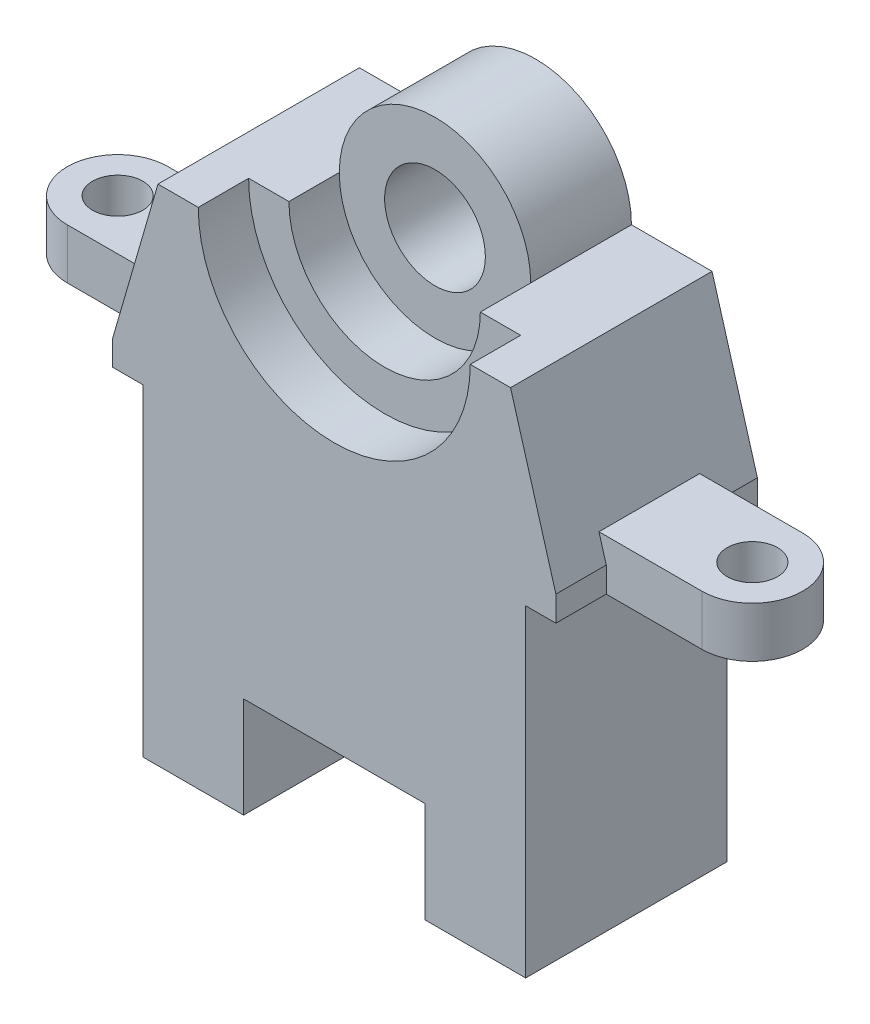
ISO-10303-21;
HEADER;
FILE_DESCRIPTION(('STEP AP214'),'2;1');
FILE_NAME('part.step','',(''),(''),'','','');
FILE_SCHEMA(('AUTOMOTIVE_DESIGN { 1 0 10303 214 1 1 1 1 }'));
ENDSEC;
DATA;
#1=APPLICATION_CONTEXT('core data for automotive mechanical design processes');
#2=APPLICATION_PROTOCOL_DEFINITION('international standard','automotive_design',2000,#1);
#3=PRODUCT_CONTEXT('',#1,'mechanical');
#4=PRODUCT('Part','Part','',(#3));
#5=PRODUCT_RELATED_PRODUCT_CATEGORY('part','',(#4));
#6=PRODUCT_DEFINITION_FORMATION('','',#4);
#7=PRODUCT_DEFINITION_CONTEXT('part definition',#1,'design');
#8=PRODUCT_DEFINITION('design','',#6,#7);
#9=PRODUCT_DEFINITION_SHAPE('','',#8);
#10=(LENGTH_UNIT() NAMED_UNIT(*) SI_UNIT(.MILLI.,.METRE.));
#11=(NAMED_UNIT(*) PLANE_ANGLE_UNIT() SI_UNIT($,.RADIAN.));
#12=(NAMED_UNIT(*) SI_UNIT($,.STERADIAN.) SOLID_ANGLE_UNIT());
#13=UNCERTAINTY_MEASURE_WITH_UNIT(LENGTH_MEASURE(1.E-05),#10,'distance_accuracy_value','');
#14=(GEOMETRIC_REPRESENTATION_CONTEXT(3) GLOBAL_UNCERTAINTY_ASSIGNED_CONTEXT((#13)) GLOBAL_UNIT_ASSIGNED_CONTEXT((#10,
#11,#12)) REPRESENTATION_CONTEXT('',''));
#15=CARTESIAN_POINT('',(0.,0.,0.));
#16=DIRECTION('',(0.,0.,1.));
#17=DIRECTION('',(1.,0.,0.));
#18=AXIS2_PLACEMENT_3D('',#15,#16,#17);
#19=CARTESIAN_POINT('',(82.,64.,40.));
#20=DIRECTION('',(-1.,0.,0.));
#21=DIRECTION('',(0.,0.,1.));
#22=AXIS2_PLACEMENT_3D('',#19,#20,#21);
#23=PLANE('',#22);
#24=DIRECTION('',(0.,-1.,0.));
#25=VECTOR('',#24,1.);
#26=CARTESIAN_POINT('',(82.,64.,30.));
#27=LINE('',#26,#25);
#28=CARTESIAN_POINT('',(82.,69.,30.));
#29=VERTEX_POINT('',#28);
#30=CARTESIAN_POINT('',(82.,64.,30.));
#31=VERTEX_POINT('',#30);
#32=EDGE_CURVE('E262',#29,#31,#27,.T.);
#33=ORIENTED_EDGE('',*,*,#32,.F.);
#34=DIRECTION('',(0.,0.,-1.));
#35=VECTOR('',#34,1.);
#36=CARTESIAN_POINT('',(82.,69.,40.));
#37=LINE('',#36,#35);
#38=CARTESIAN_POINT('',(82.,69.,40.));
#39=VERTEX_POINT('',#38);
#40=EDGE_CURVE('E423',#39,#29,#37,.T.);
#41=ORIENTED_EDGE('',*,*,#40,.F.);
#42=DIRECTION('',(0.,1.,0.));
#43=VECTOR('',#42,1.);
#44=CARTESIAN_POINT('',(82.,64.,40.));
#45=LINE('',#44,#43);
#46=CARTESIAN_POINT('',(82.,64.,40.));
#47=VERTEX_POINT('',#46);
#48=EDGE_CURVE('E354',#47,#39,#45,.T.);
#49=ORIENTED_EDGE('',*,*,#48,.F.);
#50=DIRECTION('',(0.,0.,-1.));
#51=VECTOR('',#50,1.);
#52=CARTESIAN_POINT('',(82.,64.,40.));
#53=LINE('',#52,#51);
#54=EDGE_CURVE('E56',#47,#31,#53,.T.);
#55=ORIENTED_EDGE('',*,*,#54,.T.);
#56=EDGE_LOOP('',(#33,#41,#49,#55));
#57=FACE_BOUND('',#56,.T.);
#58=ADVANCED_FACE('F33',(#57),#23,.F.);
#59=DIRECTION('',(0.,1.,0.));
#60=VECTOR('',#59,1.);
#61=CARTESIAN_POINT('',(82.,64.,10.));
#62=LINE('',#61,#60);
#63=CARTESIAN_POINT('',(82.,64.,10.));
#64=VERTEX_POINT('',#63);
#65=CARTESIAN_POINT('',(82.,69.,10.));
#66=VERTEX_POINT('',#65);
#67=EDGE_CURVE('E48',#64,#66,#62,.T.);
#68=ORIENTED_EDGE('',*,*,#67,.F.);
#69=CARTESIAN_POINT('',(82.,64.,0.));
#70=VERTEX_POINT('',#69);
#71=EDGE_CURVE('E426',#64,#70,#53,.T.);
#72=ORIENTED_EDGE('',*,*,#71,.T.);
#73=DIRECTION('',(0.,1.,0.));
#74=VECTOR('',#73,1.);
#75=CARTESIAN_POINT('',(82.,64.,0.));
#76=LINE('',#75,#74);
#77=CARTESIAN_POINT('',(82.,69.,0.));
#78=VERTEX_POINT('',#77);
#79=EDGE_CURVE('E386',#70,#78,#76,.T.);
#80=ORIENTED_EDGE('',*,*,#79,.T.);
#81=EDGE_CURVE('E422',#66,#78,#37,.T.);
#82=ORIENTED_EDGE('',*,*,#81,.F.);
#83=EDGE_LOOP('',(#68,#72,#80,#82));
#84=FACE_BOUND('',#83,.T.);
#85=ADVANCED_FACE('F462',(#84),#23,.F.);
#86=CARTESIAN_POINT('',(73.,100.,40.));
#87=DIRECTION('',(-0.960346226753624,-0.278810194863955,0.));
#88=DIRECTION('',(0.278810194863955,-0.960346226753624,0.));
#89=AXIS2_PLACEMENT_3D('',#86,#87,#88);
#90=PLANE('',#89);
#91=DIRECTION('',(0.278810194863955,-0.960346226753624,0.));
#92=VECTOR('',#91,1.);
#93=CARTESIAN_POINT('',(73.,100.,30.));
#94=LINE('',#93,#92);
#95=CARTESIAN_POINT('',(80.5483870967742,74.,30.));
#96=VERTEX_POINT('',#95);
#97=EDGE_CURVE('E11',#96,#29,#94,.T.);
#98=ORIENTED_EDGE('',*,*,#97,.F.);
#99=DIRECTION('',(0.,0.,1.));
#100=VECTOR('',#99,1.);
#101=CARTESIAN_POINT('',(80.5483870967742,74.,40.));
#102=LINE('',#101,#100);
#103=CARTESIAN_POINT('',(80.5483870967742,74.,10.));
#104=VERTEX_POINT('',#103);
#105=EDGE_CURVE('E41',#104,#96,#102,.T.);
#106=ORIENTED_EDGE('',*,*,#105,.F.);
#107=DIRECTION('',(-0.278810194863955,0.960346226753624,0.));
#108=VECTOR('',#107,1.);
#109=CARTESIAN_POINT('',(73.,100.,10.));
#110=LINE('',#109,#108);
#111=EDGE_CURVE('E456',#66,#104,#110,.T.);
#112=ORIENTED_EDGE('',*,*,#111,.F.);
#113=ORIENTED_EDGE('',*,*,#81,.T.);
#114=DIRECTION('',(-0.278810194863955,0.960346226753624,0.));
#115=VECTOR('',#114,1.);
#116=CARTESIAN_POINT('',(73.,100.,0.));
#117=LINE('',#116,#115);
#118=CARTESIAN_POINT('',(73.,100.,0.));
#119=VERTEX_POINT('',#118);
#120=EDGE_CURVE('E389',#78,#119,#117,.T.);
#121=ORIENTED_EDGE('',*,*,#120,.T.);
#122=DIRECTION('',(0.,0.,-1.));
#123=VECTOR('',#122,1.);
#124=CARTESIAN_POINT('',(73.,100.,40.));
#125=LINE('',#124,#123);
#126=CARTESIAN_POINT('',(73.,100.,40.));
#127=VERTEX_POINT('',#126);
#128=EDGE_CURVE('E419',#127,#119,#125,.T.);
#129=ORIENTED_EDGE('',*,*,#128,.F.);
#130=DIRECTION('',(-0.278810194863955,0.960346226753624,0.));
#131=VECTOR('',#130,1.);
#132=CARTESIAN_POINT('',(73.,100.,40.));
#133=LINE('',#132,#131);
#134=EDGE_CURVE('E356',#39,#127,#133,.T.);
#135=ORIENTED_EDGE('',*,*,#134,.F.);
#136=ORIENTED_EDGE('',*,*,#40,.T.);
#137=EDGE_LOOP('',(#98,#106,#112,#113,#121,#129,#135,#136));
#138=FACE_BOUND('',#137,.T.);
#139=ADVANCED_FACE('F461',(#138),#90,.F.);
#140=CARTESIAN_POINT('',(2.99999999999999,100.,40.));
#141=DIRECTION('',(0.960346226753624,-0.278810194863955,0.));
#142=DIRECTION('',(0.278810194863955,0.960346226753624,0.));
#143=AXIS2_PLACEMENT_3D('',#140,#141,#142);
#144=PLANE('',#143);
#145=DIRECTION('',(-0.278810194863955,-0.960346226753624,0.));
#146=VECTOR('',#145,1.);
#147=CARTESIAN_POINT('',(2.99999999999999,100.,10.));
#148=LINE('',#147,#146);
#149=CARTESIAN_POINT('',(-4.5483870967742,74.,10.));
#150=VERTEX_POINT('',#149);
#151=CARTESIAN_POINT('',(-6.,69.,10.));
#152=VERTEX_POINT('',#151);
#153=EDGE_CURVE('E300',#150,#152,#148,.T.);
#154=ORIENTED_EDGE('',*,*,#153,.F.);
#155=DIRECTION('',(0.,0.,1.));
#156=VECTOR('',#155,1.);
#157=CARTESIAN_POINT('',(-4.5483870967742,74.,40.));
#158=LINE('',#157,#156);
#159=CARTESIAN_POINT('',(-4.5483870967742,74.,30.));
#160=VERTEX_POINT('',#159);
#161=EDGE_CURVE('E454',#150,#160,#158,.T.);
#162=ORIENTED_EDGE('',*,*,#161,.T.);
#163=DIRECTION('',(0.278810194863955,0.960346226753624,0.));
#164=VECTOR('',#163,1.);
#165=CARTESIAN_POINT('',(2.99999999999999,100.,30.));
#166=LINE('',#165,#164);
#167=CARTESIAN_POINT('',(-6.,69.,30.));
#168=VERTEX_POINT('',#167);
#169=EDGE_CURVE('E294',#168,#160,#166,.T.);
#170=ORIENTED_EDGE('',*,*,#169,.F.);
#171=DIRECTION('',(0.,0.,-1.));
#172=VECTOR('',#171,1.);
#173=CARTESIAN_POINT('',(-6.,69.,40.));
#174=LINE('',#173,#172);
#175=CARTESIAN_POINT('',(-6.,69.,40.));
#176=VERTEX_POINT('',#175);
#177=EDGE_CURVE('E414',#176,#168,#174,.T.);
#178=ORIENTED_EDGE('',*,*,#177,.F.);
#179=DIRECTION('',(-0.278810194863955,-0.960346226753624,0.));
#180=VECTOR('',#179,1.);
#181=CARTESIAN_POINT('',(2.99999999999999,100.,40.));
#182=LINE('',#181,#180);
#183=CARTESIAN_POINT('',(2.99999999999999,100.,40.));
#184=VERTEX_POINT('',#183);
#185=EDGE_CURVE('E362',#184,#176,#182,.T.);
#186=ORIENTED_EDGE('',*,*,#185,.F.);
#187=DIRECTION('',(0.,0.,-1.));
#188=VECTOR('',#187,1.);
#189=CARTESIAN_POINT('',(2.99999999999999,100.,40.));
#190=LINE('',#189,#188);
#191=CARTESIAN_POINT('',(2.99999999999999,100.,0.));
#192=VERTEX_POINT('',#191);
#193=EDGE_CURVE('E416',#184,#192,#190,.T.);
#194=ORIENTED_EDGE('',*,*,#193,.T.);
#195=DIRECTION('',(-0.278810194863955,-0.960346226753624,0.));
#196=VECTOR('',#195,1.);
#197=CARTESIAN_POINT('',(2.99999999999999,100.,0.));
#198=LINE('',#197,#196);
#199=CARTESIAN_POINT('',(-6.,69.,0.));
#200=VERTEX_POINT('',#199);
#201=EDGE_CURVE('E395',#192,#200,#198,.T.);
#202=ORIENTED_EDGE('',*,*,#201,.T.);
#203=EDGE_CURVE('E413',#152,#200,#174,.T.);
#204=ORIENTED_EDGE('',*,*,#203,.F.);
#205=EDGE_LOOP('',(#154,#162,#170,#178,#186,#194,#202,#204));
#206=FACE_BOUND('',#205,.T.);
#207=ADVANCED_FACE('F532',(#206),#144,.F.);
#208=CARTESIAN_POINT('',(-6.,64.,40.));
#209=DIRECTION('',(1.,0.,0.));
#210=DIRECTION('',(0.,0.,-1.));
#211=AXIS2_PLACEMENT_3D('',#208,#209,#210);
#212=PLANE('',#211);
#213=DIRECTION('',(0.,-1.,0.));
#214=VECTOR('',#213,1.);
#215=CARTESIAN_POINT('',(-6.,64.,10.));
#216=LINE('',#215,#214);
#217=CARTESIAN_POINT('',(-6.,64.,10.));
#218=VERTEX_POINT('',#217);
#219=EDGE_CURVE('E297',#152,#218,#216,.T.);
#220=ORIENTED_EDGE('',*,*,#219,.F.);
#221=ORIENTED_EDGE('',*,*,#203,.T.);
#222=DIRECTION('',(0.,-1.,0.));
#223=VECTOR('',#222,1.);
#224=CARTESIAN_POINT('',(-6.,64.,0.));
#225=LINE('',#224,#223);
#226=CARTESIAN_POINT('',(-6.,64.,0.));
#227=VERTEX_POINT('',#226);
#228=EDGE_CURVE('E398',#200,#227,#225,.T.);
#229=ORIENTED_EDGE('',*,*,#228,.T.);
#230=DIRECTION('',(0.,0.,-1.));
#231=VECTOR('',#230,1.);
#232=CARTESIAN_POINT('',(-6.,64.,40.));
#233=LINE('',#232,#231);
#234=EDGE_CURVE('E409',#218,#227,#233,.T.);
#235=ORIENTED_EDGE('',*,*,#234,.F.);
#236=EDGE_LOOP('',(#220,#221,#229,#235));
#237=FACE_BOUND('',#236,.T.);
#238=ADVANCED_FACE('F528',(#237),#212,.F.);
#239=DIRECTION('',(0.,1.,0.));
#240=VECTOR('',#239,1.);
#241=CARTESIAN_POINT('',(-6.,64.,30.));
#242=LINE('',#241,#240);
#243=CARTESIAN_POINT('',(-6.,64.,30.));
#244=VERTEX_POINT('',#243);
#245=EDGE_CURVE('E291',#244,#168,#242,.T.);
#246=ORIENTED_EDGE('',*,*,#245,.F.);
#247=CARTESIAN_POINT('',(-6.,64.,40.));
#248=VERTEX_POINT('',#247);
#249=EDGE_CURVE('E410',#248,#244,#233,.T.);
#250=ORIENTED_EDGE('',*,*,#249,.F.);
#251=DIRECTION('',(0.,-1.,0.));
#252=VECTOR('',#251,1.);
#253=CARTESIAN_POINT('',(-6.,64.,40.));
#254=LINE('',#253,#252);
#255=EDGE_CURVE('E364',#176,#248,#254,.T.);
#256=ORIENTED_EDGE('',*,*,#255,.F.);
#257=ORIENTED_EDGE('',*,*,#177,.T.);
#258=EDGE_LOOP('',(#246,#250,#256,#257));
#259=FACE_BOUND('',#258,.T.);
#260=ADVANCED_FACE('F587',(#259),#212,.F.);
#261=CARTESIAN_POINT('',(73.,100.,40.));
#262=DIRECTION('',(0.,-1.,0.));
#263=DIRECTION('',(0.,0.,-1.));
#264=AXIS2_PLACEMENT_3D('',#261,#262,#263);
#265=PLANE('',#264);
#266=DIRECTION('',(-1.,0.,0.));
#267=VECTOR('',#266,1.);
#268=CARTESIAN_POINT('',(73.,100.,0.));
#269=LINE('',#268,#267);
#270=CARTESIAN_POINT('',(57.,100.,0.));
#271=VERTEX_POINT('',#270);
#272=EDGE_CURVE('E392',#119,#271,#269,.T.);
#273=ORIENTED_EDGE('',*,*,#272,.T.);
#274=DIRECTION('',(0.,0.,1.));
#275=VECTOR('',#274,1.);
#276=CARTESIAN_POINT('',(57.,100.,0.));
#277=LINE('',#276,#275);
#278=CARTESIAN_POINT('',(57.,100.,20.));
#279=VERTEX_POINT('',#278);
#280=EDGE_CURVE('E316',#271,#279,#277,.T.);
#281=ORIENTED_EDGE('',*,*,#280,.T.);
#282=DIRECTION('',(0.,0.,1.));
#283=VECTOR('',#282,1.);
#284=CARTESIAN_POINT('',(57.,100.,20.));
#285=LINE('',#284,#283);
#286=CARTESIAN_POINT('',(57.,100.,30.));
#287=VERTEX_POINT('',#286);
#288=EDGE_CURVE('E325',#279,#287,#285,.T.);
#289=ORIENTED_EDGE('',*,*,#288,.T.);
#290=DIRECTION('',(-1.,0.,0.));
#291=VECTOR('',#290,1.);
#292=CARTESIAN_POINT('',(73.,100.,30.));
#293=LINE('',#292,#291);
#294=CARTESIAN_POINT('',(65.,100.,30.));
#295=VERTEX_POINT('',#294);
#296=EDGE_CURVE('E449',#295,#287,#293,.T.);
#297=ORIENTED_EDGE('',*,*,#296,.F.);
#298=DIRECTION('',(0.,0.,1.));
#299=VECTOR('',#298,1.);
#300=CARTESIAN_POINT('',(65.,100.,30.));
#301=LINE('',#300,#299);
#302=CARTESIAN_POINT('',(65.,100.,40.));
#303=VERTEX_POINT('',#302);
#304=EDGE_CURVE('E334',#295,#303,#301,.T.);
#305=ORIENTED_EDGE('',*,*,#304,.T.);
#306=DIRECTION('',(-1.,0.,0.));
#307=VECTOR('',#306,1.);
#308=CARTESIAN_POINT('',(73.,100.,40.));
#309=LINE('',#308,#307);
#310=EDGE_CURVE('E359',#127,#303,#309,.T.);
#311=ORIENTED_EDGE('',*,*,#310,.F.);
#312=ORIENTED_EDGE('',*,*,#128,.T.);
#313=EDGE_LOOP('',(#273,#281,#289,#297,#305,#311,#312));
#314=FACE_BOUND('',#313,.T.);
#315=ADVANCED_FACE('F475',(#314),#265,.F.);
#316=CARTESIAN_POINT('',(0.,0.,40.));
#317=DIRECTION('',(0.,1.,0.));
#318=DIRECTION('',(0.,0.,1.));
#319=AXIS2_PLACEMENT_3D('',#316,#317,#318);
#320=PLANE('',#319);
#321=DIRECTION('',(1.,0.,0.));
#322=VECTOR('',#321,1.);
#323=CARTESIAN_POINT('',(0.,0.,0.));
#324=LINE('',#323,#322);
#325=CARTESIAN_POINT('',(0.,0.,0.));
#326=VERTEX_POINT('',#325);
#327=CARTESIAN_POINT('',(20.,0.,0.));
#328=VERTEX_POINT('',#327);
#329=EDGE_CURVE('E337',#326,#328,#324,.T.);
#330=ORIENTED_EDGE('',*,*,#329,.T.);
#331=DIRECTION('',(0.,0.,-1.));
#332=VECTOR('',#331,1.);
#333=CARTESIAN_POINT('',(20.,0.,40.));
#334=LINE('',#333,#332);
#335=CARTESIAN_POINT('',(20.,0.,40.));
#336=VERTEX_POINT('',#335);
#337=EDGE_CURVE('E443',#336,#328,#334,.T.);
#338=ORIENTED_EDGE('',*,*,#337,.F.);
#339=DIRECTION('',(1.,0.,0.));
#340=VECTOR('',#339,1.);
#341=CARTESIAN_POINT('',(0.,0.,40.));
#342=LINE('',#341,#340);
#343=CARTESIAN_POINT('',(0.,0.,40.));
#344=VERTEX_POINT('',#343);
#345=EDGE_CURVE('E338',#344,#336,#342,.T.);
#346=ORIENTED_EDGE('',*,*,#345,.F.);
#347=DIRECTION('',(0.,0.,-1.));
#348=VECTOR('',#347,1.);
#349=CARTESIAN_POINT('',(0.,0.,40.));
#350=LINE('',#349,#348);
#351=EDGE_CURVE('E370',#344,#326,#350,.T.);
#352=ORIENTED_EDGE('',*,*,#351,.T.);
#353=EDGE_LOOP('',(#330,#338,#346,#352));
#354=FACE_BOUND('',#353,.T.);
#355=ADVANCED_FACE('F35',(#354),#320,.F.);
#356=CARTESIAN_POINT('',(20.,0.,40.));
#357=DIRECTION('',(-1.,0.,0.));
#358=DIRECTION('',(0.,0.,1.));
#359=AXIS2_PLACEMENT_3D('',#356,#357,#358);
#360=PLANE('',#359);
#361=DIRECTION('',(0.,1.,0.));
#362=VECTOR('',#361,1.);
#363=CARTESIAN_POINT('',(20.,0.,0.));
#364=LINE('',#363,#362);
#365=CARTESIAN_POINT('',(20.,20.,0.));
#366=VERTEX_POINT('',#365);
#367=EDGE_CURVE('E373',#328,#366,#364,.T.);
#368=ORIENTED_EDGE('',*,*,#367,.T.);
#369=DIRECTION('',(0.,0.,-1.));
#370=VECTOR('',#369,1.);
#371=CARTESIAN_POINT('',(20.,20.,40.));
#372=LINE('',#371,#370);
#373=CARTESIAN_POINT('',(20.,20.,40.));
#374=VERTEX_POINT('',#373);
#375=EDGE_CURVE('E440',#374,#366,#372,.T.);
#376=ORIENTED_EDGE('',*,*,#375,.F.);
#377=DIRECTION('',(0.,1.,0.));
#378=VECTOR('',#377,1.);
#379=CARTESIAN_POINT('',(20.,0.,40.));
#380=LINE('',#379,#378);
#381=EDGE_CURVE('E341',#336,#374,#380,.T.);
#382=ORIENTED_EDGE('',*,*,#381,.F.);
#383=ORIENTED_EDGE('',*,*,#337,.T.);
#384=EDGE_LOOP('',(#368,#376,#382,#383));
#385=FACE_BOUND('',#384,.T.);
#386=ADVANCED_FACE('F509',(#385),#360,.F.);
#387=CARTESIAN_POINT('',(20.,20.,40.));
#388=DIRECTION('',(0.,1.,0.));
#389=DIRECTION('',(0.,0.,1.));
#390=AXIS2_PLACEMENT_3D('',#387,#388,#389);
#391=PLANE('',#390);
#392=DIRECTION('',(1.,0.,0.));
#393=VECTOR('',#392,1.);
#394=CARTESIAN_POINT('',(20.,20.,0.));
#395=LINE('',#394,#393);
#396=CARTESIAN_POINT('',(56.,20.,0.));
#397=VERTEX_POINT('',#396);
#398=EDGE_CURVE('E375',#366,#397,#395,.T.);
#399=ORIENTED_EDGE('',*,*,#398,.T.);
#400=DIRECTION('',(0.,0.,-1.));
#401=VECTOR('',#400,1.);
#402=CARTESIAN_POINT('',(56.,20.,40.));
#403=LINE('',#402,#401);
#404=CARTESIAN_POINT('',(56.,20.,40.));
#405=VERTEX_POINT('',#404);
#406=EDGE_CURVE('E437',#405,#397,#403,.T.);
#407=ORIENTED_EDGE('',*,*,#406,.F.);
#408=DIRECTION('',(1.,0.,0.));
#409=VECTOR('',#408,1.);
#410=CARTESIAN_POINT('',(20.,20.,40.));
#411=LINE('',#410,#409);
#412=EDGE_CURVE('E344',#374,#405,#411,.T.);
#413=ORIENTED_EDGE('',*,*,#412,.F.);
#414=ORIENTED_EDGE('',*,*,#375,.T.);
#415=EDGE_LOOP('',(#399,#407,#413,#414));
#416=FACE_BOUND('',#415,.T.);
#417=ADVANCED_FACE('F505',(#416),#391,.F.);
#418=CARTESIAN_POINT('',(56.,20.,40.));
#419=DIRECTION('',(1.,0.,0.));
#420=DIRECTION('',(0.,0.,-1.));
#421=AXIS2_PLACEMENT_3D('',#418,#419,#420);
#422=PLANE('',#421);
#423=DIRECTION('',(0.,-1.,0.));
#424=VECTOR('',#423,1.);
#425=CARTESIAN_POINT('',(56.,20.,0.));
#426=LINE('',#425,#424);
#427=CARTESIAN_POINT('',(56.,0.,0.));
#428=VERTEX_POINT('',#427);
#429=EDGE_CURVE('E377',#397,#428,#426,.T.);
#430=ORIENTED_EDGE('',*,*,#429,.T.);
#431=DIRECTION('',(0.,0.,-1.));
#432=VECTOR('',#431,1.);
#433=CARTESIAN_POINT('',(56.,0.,40.));
#434=LINE('',#433,#432);
#435=CARTESIAN_POINT('',(56.,0.,40.));
#436=VERTEX_POINT('',#435);
#437=EDGE_CURVE('E434',#436,#428,#434,.T.);
#438=ORIENTED_EDGE('',*,*,#437,.F.);
#439=DIRECTION('',(0.,-1.,0.));
#440=VECTOR('',#439,1.);
#441=CARTESIAN_POINT('',(56.,20.,40.));
#442=LINE('',#441,#440);
#443=EDGE_CURVE('E346',#405,#436,#442,.T.);
#444=ORIENTED_EDGE('',*,*,#443,.F.);
#445=ORIENTED_EDGE('',*,*,#406,.T.);
#446=EDGE_LOOP('',(#430,#438,#444,#445));
#447=FACE_BOUND('',#446,.T.);
#448=ADVANCED_FACE('F500',(#447),#422,.F.);
#449=CARTESIAN_POINT('',(56.,0.,40.));
#450=DIRECTION('',(0.,1.,0.));
#451=DIRECTION('',(0.,0.,1.));
#452=AXIS2_PLACEMENT_3D('',#449,#450,#451);
#453=PLANE('',#452);
#454=DIRECTION('',(1.,0.,0.));
#455=VECTOR('',#454,1.);
#456=CARTESIAN_POINT('',(56.,0.,0.));
#457=LINE('',#456,#455);
#458=CARTESIAN_POINT('',(76.,0.,0.));
#459=VERTEX_POINT('',#458);
#460=EDGE_CURVE('E379',#428,#459,#457,.T.);
#461=ORIENTED_EDGE('',*,*,#460,.T.);
#462=DIRECTION('',(0.,0.,-1.));
#463=VECTOR('',#462,1.);
#464=CARTESIAN_POINT('',(76.,0.,40.));
#465=LINE('',#464,#463);
#466=CARTESIAN_POINT('',(76.,0.,40.));
#467=VERTEX_POINT('',#466);
#468=EDGE_CURVE('E431',#467,#459,#465,.T.);
#469=ORIENTED_EDGE('',*,*,#468,.F.);
#470=DIRECTION('',(1.,0.,0.));
#471=VECTOR('',#470,1.);
#472=CARTESIAN_POINT('',(56.,0.,40.));
#473=LINE('',#472,#471);
#474=EDGE_CURVE('E348',#436,#467,#473,.T.);
#475=ORIENTED_EDGE('',*,*,#474,.F.);
#476=ORIENTED_EDGE('',*,*,#437,.T.);
#477=EDGE_LOOP('',(#461,#469,#475,#476));
#478=FACE_BOUND('',#477,.T.);
#479=ADVANCED_FACE('F496',(#478),#453,.F.);
#480=CARTESIAN_POINT('',(76.,0.,40.));
#481=DIRECTION('',(-1.,0.,0.));
#482=DIRECTION('',(0.,0.,1.));
#483=AXIS2_PLACEMENT_3D('',#480,#481,#482);
#484=PLANE('',#483);
#485=DIRECTION('',(0.,1.,0.));
#486=VECTOR('',#485,1.);
#487=CARTESIAN_POINT('',(76.,0.,0.));
#488=LINE('',#487,#486);
#489=CARTESIAN_POINT('',(76.,64.,0.));
#490=VERTEX_POINT('',#489);
#491=EDGE_CURVE('E381',#459,#490,#488,.T.);
#492=ORIENTED_EDGE('',*,*,#491,.T.);
#493=DIRECTION('',(0.,0.,-1.));
#494=VECTOR('',#493,1.);
#495=CARTESIAN_POINT('',(76.,64.,40.));
#496=LINE('',#495,#494);
#497=CARTESIAN_POINT('',(76.,64.,40.));
#498=VERTEX_POINT('',#497);
#499=EDGE_CURVE('E428',#498,#490,#496,.T.);
#500=ORIENTED_EDGE('',*,*,#499,.F.);
#501=DIRECTION('',(0.,1.,0.));
#502=VECTOR('',#501,1.);
#503=CARTESIAN_POINT('',(76.,0.,40.));
#504=LINE('',#503,#502);
#505=EDGE_CURVE('E350',#467,#498,#504,.T.);
#506=ORIENTED_EDGE('',*,*,#505,.F.);
#507=ORIENTED_EDGE('',*,*,#468,.T.);
#508=EDGE_LOOP('',(#492,#500,#506,#507));
#509=FACE_BOUND('',#508,.T.);
#510=ADVANCED_FACE('F491',(#509),#484,.F.);
#511=CARTESIAN_POINT('',(76.,64.,40.));
#512=DIRECTION('',(0.,1.,0.));
#513=DIRECTION('',(0.,0.,1.));
#514=AXIS2_PLACEMENT_3D('',#511,#512,#513);
#515=PLANE('',#514);
#516=DIRECTION('',(1.,0.,0.));
#517=VECTOR('',#516,1.);
#518=CARTESIAN_POINT('',(101.,64.,30.));
#519=LINE('',#518,#517);
#520=CARTESIAN_POINT('',(101.,64.,30.));
#521=VERTEX_POINT('',#520);
#522=EDGE_CURVE('E240',#31,#521,#519,.T.);
#523=ORIENTED_EDGE('',*,*,#522,.F.);
#524=ORIENTED_EDGE('',*,*,#54,.F.);
#525=DIRECTION('',(1.,0.,0.));
#526=VECTOR('',#525,1.);
#527=CARTESIAN_POINT('',(76.,64.,40.));
#528=LINE('',#527,#526);
#529=EDGE_CURVE('E352',#498,#47,#528,.T.);
#530=ORIENTED_EDGE('',*,*,#529,.F.);
#531=ORIENTED_EDGE('',*,*,#499,.T.);
#532=DIRECTION('',(1.,0.,0.));
#533=VECTOR('',#532,1.);
#534=CARTESIAN_POINT('',(76.,64.,0.));
#535=LINE('',#534,#533);
#536=EDGE_CURVE('E383',#490,#70,#535,.T.);
#537=ORIENTED_EDGE('',*,*,#536,.T.);
#538=ORIENTED_EDGE('',*,*,#71,.F.);
#539=DIRECTION('',(-1.,0.,0.));
#540=VECTOR('',#539,1.);
#541=CARTESIAN_POINT('',(82.,64.,10.));
#542=LINE('',#541,#540);
#543=CARTESIAN_POINT('',(101.,64.,10.));
#544=VERTEX_POINT('',#543);
#545=EDGE_CURVE('E234',#544,#64,#542,.T.);
#546=ORIENTED_EDGE('',*,*,#545,.F.);
#547=CARTESIAN_POINT('',(101.,64.,20.));
#548=DIRECTION('',(0.,1.,0.));
#549=DIRECTION('',(0.,0.,-1.));
#550=AXIS2_PLACEMENT_3D('',#547,#548,#549);
#551=CIRCLE('',#550,10.);
#552=EDGE_CURVE('E255',#521,#544,#551,.T.);
#553=ORIENTED_EDGE('',*,*,#552,.F.);
#554=EDGE_LOOP('',(#523,#524,#530,#531,#537,#538,#546,#553));
#555=FACE_BOUND('',#554,.T.);
#556=CARTESIAN_POINT('',(101.,64.,20.));
#557=DIRECTION('',(0.,1.,0.));
#558=DIRECTION('',(0.,0.,-1.));
#559=AXIS2_PLACEMENT_3D('',#556,#557,#558);
#560=CIRCLE('',#559,5.);
#561=CARTESIAN_POINT('',(101.,64.,15.));
#562=VERTEX_POINT('',#561);
#563=EDGE_CURVE('E847',#562,#562,#560,.T.);
#564=ORIENTED_EDGE('',*,*,#563,.T.);
#565=EDGE_LOOP('',(#564));
#566=FACE_BOUND('',#565,.T.);
#567=ADVANCED_FACE('F483',(#555,#566),#515,.F.);
#568=DIRECTION('',(0.,0.,1.));
#569=VECTOR('',#568,1.);
#570=CARTESIAN_POINT('',(19.,100.,20.));
#571=LINE('',#570,#569);
#572=CARTESIAN_POINT('',(19.,100.,30.));
#573=VERTEX_POINT('',#572);
#574=CARTESIAN_POINT('',(19.,100.,20.));
#575=VERTEX_POINT('',#574);
#576=EDGE_CURVE('E322',#573,#575,#571,.F.);
#577=ORIENTED_EDGE('',*,*,#576,.T.);
#578=DIRECTION('',(0.,0.,1.));
#579=VECTOR('',#578,1.);
#580=CARTESIAN_POINT('',(19.,100.,0.));
#581=LINE('',#580,#579);
#582=CARTESIAN_POINT('',(19.,100.,0.));
#583=VERTEX_POINT('',#582);
#584=EDGE_CURVE('E312',#575,#583,#581,.F.);
#585=ORIENTED_EDGE('',*,*,#584,.T.);
#586=EDGE_CURVE('E391',#583,#192,#269,.T.);
#587=ORIENTED_EDGE('',*,*,#586,.T.);
#588=ORIENTED_EDGE('',*,*,#193,.F.);
#589=CARTESIAN_POINT('',(11.,100.,40.));
#590=VERTEX_POINT('',#589);
#591=EDGE_CURVE('E358',#590,#184,#309,.T.);
#592=ORIENTED_EDGE('',*,*,#591,.F.);
#593=DIRECTION('',(0.,0.,1.));
#594=VECTOR('',#593,1.);
#595=CARTESIAN_POINT('',(11.,100.,30.));
#596=LINE('',#595,#594);
#597=CARTESIAN_POINT('',(11.,100.,30.));
#598=VERTEX_POINT('',#597);
#599=EDGE_CURVE('E331',#590,#598,#596,.F.);
#600=ORIENTED_EDGE('',*,*,#599,.T.);
#601=EDGE_CURVE('E448',#573,#598,#293,.T.);
#602=ORIENTED_EDGE('',*,*,#601,.F.);
#603=EDGE_LOOP('',(#577,#585,#587,#588,#592,#600,#602));
#604=FACE_BOUND('',#603,.T.);
#605=ADVANCED_FACE('F537',(#604),#265,.F.);
#606=CARTESIAN_POINT('',(0.,64.,40.));
#607=DIRECTION('',(0.,1.,0.));
#608=DIRECTION('',(0.,0.,1.));
#609=AXIS2_PLACEMENT_3D('',#606,#607,#608);
#610=PLANE('',#609);
#611=ORIENTED_EDGE('',*,*,#249,.T.);
#612=DIRECTION('',(1.,0.,0.));
#613=VECTOR('',#612,1.);
#614=CARTESIAN_POINT('',(-25.,64.,30.));
#615=LINE('',#614,#613);
#616=CARTESIAN_POINT('',(-25.,64.,30.));
#617=VERTEX_POINT('',#616);
#618=EDGE_CURVE('E275',#617,#244,#615,.T.);
#619=ORIENTED_EDGE('',*,*,#618,.F.);
#620=CARTESIAN_POINT('',(-25.,64.,20.));
#621=DIRECTION('',(0.,1.,0.));
#622=DIRECTION('',(0.,0.,1.));
#623=AXIS2_PLACEMENT_3D('',#620,#621,#622);
#624=CIRCLE('',#623,10.);
#625=CARTESIAN_POINT('',(-25.,64.,10.));
#626=VERTEX_POINT('',#625);
#627=EDGE_CURVE('E282',#626,#617,#624,.T.);
#628=ORIENTED_EDGE('',*,*,#627,.F.);
#629=DIRECTION('',(-1.,0.,0.));
#630=VECTOR('',#629,1.);
#631=CARTESIAN_POINT('',(-25.,64.,10.));
#632=LINE('',#631,#630);
#633=EDGE_CURVE('E268',#218,#626,#632,.T.);
#634=ORIENTED_EDGE('',*,*,#633,.F.);
#635=ORIENTED_EDGE('',*,*,#234,.T.);
#636=DIRECTION('',(1.,0.,0.));
#637=VECTOR('',#636,1.);
#638=CARTESIAN_POINT('',(0.,64.,0.));
#639=LINE('',#638,#637);
#640=CARTESIAN_POINT('',(0.,64.,0.));
#641=VERTEX_POINT('',#640);
#642=EDGE_CURVE('E401',#227,#641,#639,.T.);
#643=ORIENTED_EDGE('',*,*,#642,.T.);
#644=DIRECTION('',(0.,0.,-1.));
#645=VECTOR('',#644,1.);
#646=CARTESIAN_POINT('',(0.,64.,40.));
#647=LINE('',#646,#645);
#648=CARTESIAN_POINT('',(0.,64.,40.));
#649=VERTEX_POINT('',#648);
#650=EDGE_CURVE('E406',#649,#641,#647,.T.);
#651=ORIENTED_EDGE('',*,*,#650,.F.);
#652=DIRECTION('',(1.,0.,0.));
#653=VECTOR('',#652,1.);
#654=CARTESIAN_POINT('',(0.,64.,40.));
#655=LINE('',#654,#653);
#656=EDGE_CURVE('E366',#248,#649,#655,.T.);
#657=ORIENTED_EDGE('',*,*,#656,.F.);
#658=EDGE_LOOP('',(#611,#619,#628,#634,#635,#643,#651,#657));
#659=FACE_BOUND('',#658,.T.);
#660=CARTESIAN_POINT('',(-25.,64.,20.));
#661=DIRECTION('',(0.,1.,0.));
#662=DIRECTION('',(0.,0.,1.));
#663=AXIS2_PLACEMENT_3D('',#660,#661,#662);
#664=CIRCLE('',#663,5.);
#665=CARTESIAN_POINT('',(-25.,64.,25.));
#666=VERTEX_POINT('',#665);
#667=EDGE_CURVE('E264',#666,#666,#664,.T.);
#668=ORIENTED_EDGE('',*,*,#667,.T.);
#669=EDGE_LOOP('',(#668));
#670=FACE_BOUND('',#669,.T.);
#671=ADVANCED_FACE('F523',(#659,#670),#610,.F.);
#672=CARTESIAN_POINT('',(0.,0.,40.));
#673=DIRECTION('',(1.,0.,0.));
#674=DIRECTION('',(0.,0.,-1.));
#675=AXIS2_PLACEMENT_3D('',#672,#673,#674);
#676=PLANE('',#675);
#677=DIRECTION('',(0.,-1.,0.));
#678=VECTOR('',#677,1.);
#679=CARTESIAN_POINT('',(0.,0.,0.));
#680=LINE('',#679,#678);
#681=EDGE_CURVE('E342',#641,#326,#680,.T.);
#682=ORIENTED_EDGE('',*,*,#681,.T.);
#683=ORIENTED_EDGE('',*,*,#351,.F.);
#684=DIRECTION('',(0.,-1.,0.));
#685=VECTOR('',#684,1.);
#686=CARTESIAN_POINT('',(0.,0.,40.));
#687=LINE('',#686,#685);
#688=EDGE_CURVE('E368',#649,#344,#687,.T.);
#689=ORIENTED_EDGE('',*,*,#688,.F.);
#690=ORIENTED_EDGE('',*,*,#650,.T.);
#691=EDGE_LOOP('',(#682,#683,#689,#690));
#692=FACE_BOUND('',#691,.T.);
#693=ADVANCED_FACE('F518',(#692),#676,.F.);
#694=CARTESIAN_POINT('',(0.,0.,40.));
#695=DIRECTION('',(0.,0.,1.));
#696=DIRECTION('',(1.,0.,0.));
#697=AXIS2_PLACEMENT_3D('',#694,#695,#696);
#698=PLANE('',#697);
#699=CARTESIAN_POINT('',(38.,100.,40.));
#700=DIRECTION('',(0.,0.,1.));
#701=DIRECTION('',(1.,0.,0.));
#702=AXIS2_PLACEMENT_3D('',#699,#700,#701);
#703=CIRCLE('',#702,27.);
#704=EDGE_CURVE('E446',#590,#303,#703,.T.);
#705=ORIENTED_EDGE('',*,*,#704,.F.);
#706=ORIENTED_EDGE('',*,*,#591,.T.);
#707=ORIENTED_EDGE('',*,*,#185,.T.);
#708=ORIENTED_EDGE('',*,*,#255,.T.);
#709=ORIENTED_EDGE('',*,*,#656,.T.);
#710=ORIENTED_EDGE('',*,*,#688,.T.);
#711=ORIENTED_EDGE('',*,*,#345,.T.);
#712=ORIENTED_EDGE('',*,*,#381,.T.);
#713=ORIENTED_EDGE('',*,*,#412,.T.);
#714=ORIENTED_EDGE('',*,*,#443,.T.);
#715=ORIENTED_EDGE('',*,*,#474,.T.);
#716=ORIENTED_EDGE('',*,*,#505,.T.);
#717=ORIENTED_EDGE('',*,*,#529,.T.);
#718=ORIENTED_EDGE('',*,*,#48,.T.);
#719=ORIENTED_EDGE('',*,*,#134,.T.);
#720=ORIENTED_EDGE('',*,*,#310,.T.);
#721=EDGE_LOOP('',(#705,#706,#707,#708,#709,#710,#711,#712,#713,#714,#715,#716,#717,#718,#719,#720));
#722=FACE_BOUND('',#721,.T.);
#723=ADVANCED_FACE('F479',(#722),#698,.T.);
#724=CARTESIAN_POINT('',(0.,0.,0.));
#725=DIRECTION('',(0.,0.,1.));
#726=DIRECTION('',(1.,0.,0.));
#727=AXIS2_PLACEMENT_3D('',#724,#725,#726);
#728=PLANE('',#727);
#729=CARTESIAN_POINT('',(38.,100.,0.));
#730=DIRECTION('',(0.,0.,1.));
#731=DIRECTION('',(1.,0.,0.));
#732=AXIS2_PLACEMENT_3D('',#729,#730,#731);
#733=CIRCLE('',#732,10.);
#734=CARTESIAN_POINT('',(48.,100.,0.));
#735=VERTEX_POINT('',#734);
#736=EDGE_CURVE('E304',#735,#735,#733,.T.);
#737=ORIENTED_EDGE('',*,*,#736,.T.);
#738=EDGE_LOOP('',(#737));
#739=FACE_BOUND('',#738,.T.);
#740=ORIENTED_EDGE('',*,*,#586,.F.);
#741=CARTESIAN_POINT('',(38.,100.,0.));
#742=DIRECTION('',(0.,0.,1.));
#743=DIRECTION('',(1.,0.,0.));
#744=AXIS2_PLACEMENT_3D('',#741,#742,#743);
#745=CIRCLE('',#744,19.);
#746=EDGE_CURVE('E310',#271,#583,#745,.T.);
#747=ORIENTED_EDGE('',*,*,#746,.F.);
#748=ORIENTED_EDGE('',*,*,#272,.F.);
#749=ORIENTED_EDGE('',*,*,#120,.F.);
#750=ORIENTED_EDGE('',*,*,#79,.F.);
#751=ORIENTED_EDGE('',*,*,#536,.F.);
#752=ORIENTED_EDGE('',*,*,#491,.F.);
#753=ORIENTED_EDGE('',*,*,#460,.F.);
#754=ORIENTED_EDGE('',*,*,#429,.F.);
#755=ORIENTED_EDGE('',*,*,#398,.F.);
#756=ORIENTED_EDGE('',*,*,#367,.F.);
#757=ORIENTED_EDGE('',*,*,#329,.F.);
#758=ORIENTED_EDGE('',*,*,#681,.F.);
#759=ORIENTED_EDGE('',*,*,#642,.F.);
#760=ORIENTED_EDGE('',*,*,#228,.F.);
#761=ORIENTED_EDGE('',*,*,#201,.F.);
#762=EDGE_LOOP('',(#740,#747,#748,#749,#750,#751,#752,#753,#754,#755,#756,#757,#758,#759,#760,#761));
#763=FACE_BOUND('',#762,.T.);
#764=ADVANCED_FACE('F469',(#739,#763),#728,.F.);
#765=CARTESIAN_POINT('',(38.,100.,30.));
#766=DIRECTION('',(0.,0.,1.));
#767=DIRECTION('',(1.,0.,0.));
#768=AXIS2_PLACEMENT_3D('',#765,#766,#767);
#769=PLANE('',#768);
#770=CARTESIAN_POINT('',(38.,100.,30.));
#771=DIRECTION('',(0.,0.,1.));
#772=DIRECTION('',(1.,0.,0.));
#773=AXIS2_PLACEMENT_3D('',#770,#771,#772);
#774=CIRCLE('',#773,19.);
#775=EDGE_CURVE('E452',#573,#287,#774,.T.);
#776=ORIENTED_EDGE('',*,*,#775,.F.);
#777=ORIENTED_EDGE('',*,*,#601,.T.);
#778=CARTESIAN_POINT('',(38.,100.,30.));
#779=DIRECTION('',(0.,0.,1.));
#780=DIRECTION('',(1.,0.,0.));
#781=AXIS2_PLACEMENT_3D('',#778,#779,#780);
#782=CIRCLE('',#781,27.);
#783=EDGE_CURVE('E328',#598,#295,#782,.T.);
#784=ORIENTED_EDGE('',*,*,#783,.T.);
#785=ORIENTED_EDGE('',*,*,#296,.T.);
#786=EDGE_LOOP('',(#776,#777,#784,#785));
#787=FACE_BOUND('',#786,.T.);
#788=ADVANCED_FACE('F558',(#787),#769,.T.);
#789=CARTESIAN_POINT('',(38.,100.,30.));
#790=DIRECTION('',(0.,0.,1.));
#791=DIRECTION('',(1.,0.,0.));
#792=AXIS2_PLACEMENT_3D('',#789,#790,#791);
#793=CYLINDRICAL_SURFACE('',#792,27.);
#794=ORIENTED_EDGE('',*,*,#783,.F.);
#795=ORIENTED_EDGE('',*,*,#599,.F.);
#796=ORIENTED_EDGE('',*,*,#704,.T.);
#797=ORIENTED_EDGE('',*,*,#304,.F.);
#798=EDGE_LOOP('',(#794,#795,#796,#797));
#799=FACE_BOUND('',#798,.T.);
#800=ADVANCED_FACE('F550',(#799),#793,.F.);
#801=CARTESIAN_POINT('',(38.,100.,20.));
#802=DIRECTION('',(0.,0.,1.));
#803=DIRECTION('',(1.,0.,0.));
#804=AXIS2_PLACEMENT_3D('',#801,#802,#803);
#805=PLANE('',#804);
#806=CARTESIAN_POINT('',(38.,100.,20.));
#807=DIRECTION('',(0.,0.,1.));
#808=DIRECTION('',(1.,0.,0.));
#809=AXIS2_PLACEMENT_3D('',#806,#807,#808);
#810=CIRCLE('',#809,10.);
#811=CARTESIAN_POINT('',(48.,100.,20.));
#812=VERTEX_POINT('',#811);
#813=EDGE_CURVE('E303',#812,#812,#810,.T.);
#814=ORIENTED_EDGE('',*,*,#813,.F.);
#815=EDGE_LOOP('',(#814));
#816=FACE_BOUND('',#815,.T.);
#817=CARTESIAN_POINT('',(38.,100.,20.));
#818=DIRECTION('',(0.,0.,1.));
#819=DIRECTION('',(1.,0.,0.));
#820=AXIS2_PLACEMENT_3D('',#817,#818,#819);
#821=CIRCLE('',#820,19.);
#822=EDGE_CURVE('E319',#575,#279,#821,.T.);
#823=ORIENTED_EDGE('',*,*,#822,.T.);
#824=CARTESIAN_POINT('',(38.,100.,20.));
#825=DIRECTION('',(0.,0.,1.));
#826=DIRECTION('',(1.,0.,0.));
#827=AXIS2_PLACEMENT_3D('',#824,#825,#826);
#828=CIRCLE('',#827,19.);
#829=EDGE_CURVE('E307',#279,#575,#828,.T.);
#830=ORIENTED_EDGE('',*,*,#829,.T.);
#831=EDGE_LOOP('',(#823,#830));
#832=FACE_BOUND('',#831,.T.);
#833=ADVANCED_FACE('F548',(#816,#832),#805,.T.);
#834=CARTESIAN_POINT('',(38.,100.,20.));
#835=DIRECTION('',(0.,0.,1.));
#836=DIRECTION('',(1.,0.,0.));
#837=AXIS2_PLACEMENT_3D('',#834,#835,#836);
#838=CYLINDRICAL_SURFACE('',#837,19.);
#839=ORIENTED_EDGE('',*,*,#822,.F.);
#840=ORIENTED_EDGE('',*,*,#576,.F.);
#841=ORIENTED_EDGE('',*,*,#775,.T.);
#842=ORIENTED_EDGE('',*,*,#288,.F.);
#843=EDGE_LOOP('',(#839,#840,#841,#842));
#844=FACE_BOUND('',#843,.T.);
#845=ADVANCED_FACE('F545',(#844),#838,.F.);
#846=CARTESIAN_POINT('',(38.,100.,0.));
#847=DIRECTION('',(0.,0.,1.));
#848=DIRECTION('',(1.,0.,0.));
#849=AXIS2_PLACEMENT_3D('',#846,#847,#848);
#850=CYLINDRICAL_SURFACE('',#849,19.);
#851=ORIENTED_EDGE('',*,*,#280,.F.);
#852=ORIENTED_EDGE('',*,*,#746,.T.);
#853=ORIENTED_EDGE('',*,*,#584,.F.);
#854=ORIENTED_EDGE('',*,*,#829,.F.);
#855=EDGE_LOOP('',(#851,#852,#853,#854));
#856=FACE_BOUND('',#855,.T.);
#857=ADVANCED_FACE('F542',(#856),#850,.T.);
#858=CARTESIAN_POINT('',(38.,100.,0.));
#859=DIRECTION('',(0.,0.,1.));
#860=DIRECTION('',(1.,0.,0.));
#861=AXIS2_PLACEMENT_3D('',#858,#859,#860);
#862=CYLINDRICAL_SURFACE('',#861,10.);
#863=ORIENTED_EDGE('',*,*,#736,.F.);
#864=EDGE_LOOP('',(#863));
#865=FACE_BOUND('',#864,.T.);
#866=ORIENTED_EDGE('',*,*,#813,.T.);
#867=EDGE_LOOP('',(#866));
#868=FACE_BOUND('',#867,.T.);
#869=ADVANCED_FACE('F625',(#865,#868),#862,.F.);
#870=CARTESIAN_POINT('',(-25.,74.,20.));
#871=DIRECTION('',(0.,1.,0.));
#872=DIRECTION('',(0.,0.,1.));
#873=AXIS2_PLACEMENT_3D('',#870,#871,#872);
#874=PLANE('',#873);
#875=CARTESIAN_POINT('',(-25.,74.,20.));
#876=DIRECTION('',(0.,1.,0.));
#877=DIRECTION('',(0.,0.,1.));
#878=AXIS2_PLACEMENT_3D('',#875,#876,#877);
#879=CIRCLE('',#878,5.);
#880=CARTESIAN_POINT('',(-25.,74.,25.));
#881=VERTEX_POINT('',#880);
#882=EDGE_CURVE('E265',#881,#881,#879,.T.);
#883=ORIENTED_EDGE('',*,*,#882,.F.);
#884=EDGE_LOOP('',(#883));
#885=FACE_BOUND('',#884,.T.);
#886=ORIENTED_EDGE('',*,*,#161,.F.);
#887=DIRECTION('',(-1.,0.,0.));
#888=VECTOR('',#887,1.);
#889=CARTESIAN_POINT('',(-6.,74.,10.));
#890=LINE('',#889,#888);
#891=CARTESIAN_POINT('',(-25.,74.,10.));
#892=VERTEX_POINT('',#891);
#893=EDGE_CURVE('E274',#150,#892,#890,.T.);
#894=ORIENTED_EDGE('',*,*,#893,.T.);
#895=CARTESIAN_POINT('',(-25.,74.,20.));
#896=DIRECTION('',(0.,1.,0.));
#897=DIRECTION('',(0.,0.,1.));
#898=AXIS2_PLACEMENT_3D('',#895,#896,#897);
#899=CIRCLE('',#898,10.);
#900=CARTESIAN_POINT('',(-25.,74.,30.));
#901=VERTEX_POINT('',#900);
#902=EDGE_CURVE('E277',#892,#901,#899,.T.);
#903=ORIENTED_EDGE('',*,*,#902,.T.);
#904=DIRECTION('',(1.,0.,0.));
#905=VECTOR('',#904,1.);
#906=CARTESIAN_POINT('',(-2.38992253484026,74.,30.));
#907=LINE('',#906,#905);
#908=EDGE_CURVE('E271',#901,#160,#907,.T.);
#909=ORIENTED_EDGE('',*,*,#908,.T.);
#910=EDGE_LOOP('',(#886,#894,#903,#909));
#911=FACE_BOUND('',#910,.T.);
#912=ADVANCED_FACE('F629',(#885,#911),#874,.T.);
#913=CARTESIAN_POINT('',(-25.,74.,10.));
#914=DIRECTION('',(0.,0.,1.));
#915=DIRECTION('',(1.,0.,0.));
#916=AXIS2_PLACEMENT_3D('',#913,#914,#915);
#917=PLANE('',#916);
#918=ORIENTED_EDGE('',*,*,#893,.F.);
#919=ORIENTED_EDGE('',*,*,#153,.T.);
#920=ORIENTED_EDGE('',*,*,#219,.T.);
#921=ORIENTED_EDGE('',*,*,#633,.T.);
#922=DIRECTION('',(0.,-1.,0.));
#923=VECTOR('',#922,1.);
#924=CARTESIAN_POINT('',(-25.,74.,10.));
#925=LINE('',#924,#923);
#926=EDGE_CURVE('E288',#892,#626,#925,.T.);
#927=ORIENTED_EDGE('',*,*,#926,.F.);
#928=EDGE_LOOP('',(#918,#919,#920,#921,#927));
#929=FACE_BOUND('',#928,.T.);
#930=ADVANCED_FACE('F751',(#929),#917,.F.);
#931=CARTESIAN_POINT('',(-25.,74.,30.));
#932=DIRECTION('',(0.,0.,-1.));
#933=DIRECTION('',(-1.,0.,0.));
#934=AXIS2_PLACEMENT_3D('',#931,#932,#933);
#935=PLANE('',#934);
#936=ORIENTED_EDGE('',*,*,#245,.T.);
#937=ORIENTED_EDGE('',*,*,#169,.T.);
#938=ORIENTED_EDGE('',*,*,#908,.F.);
#939=DIRECTION('',(0.,-1.,0.));
#940=VECTOR('',#939,1.);
#941=CARTESIAN_POINT('',(-25.,74.,30.));
#942=LINE('',#941,#940);
#943=EDGE_CURVE('E280',#901,#617,#942,.T.);
#944=ORIENTED_EDGE('',*,*,#943,.T.);
#945=ORIENTED_EDGE('',*,*,#618,.T.);
#946=EDGE_LOOP('',(#936,#937,#938,#944,#945));
#947=FACE_BOUND('',#946,.T.);
#948=ADVANCED_FACE('F762',(#947),#935,.F.);
#949=CARTESIAN_POINT('',(-25.,74.,20.));
#950=DIRECTION('',(0.,-1.,0.));
#951=DIRECTION('',(0.,0.,-1.));
#952=AXIS2_PLACEMENT_3D('',#949,#950,#951);
#953=CYLINDRICAL_SURFACE('',#952,10.);
#954=ORIENTED_EDGE('',*,*,#627,.T.);
#955=ORIENTED_EDGE('',*,*,#943,.F.);
#956=ORIENTED_EDGE('',*,*,#902,.F.);
#957=ORIENTED_EDGE('',*,*,#926,.T.);
#958=EDGE_LOOP('',(#954,#955,#956,#957));
#959=FACE_BOUND('',#958,.T.);
#960=ADVANCED_FACE('F773',(#959),#953,.T.);
#961=CARTESIAN_POINT('',(-25.,74.,20.));
#962=DIRECTION('',(0.,-1.,0.));
#963=DIRECTION('',(0.,0.,-1.));
#964=AXIS2_PLACEMENT_3D('',#961,#962,#963);
#965=CYLINDRICAL_SURFACE('',#964,5.);
#966=ORIENTED_EDGE('',*,*,#882,.T.);
#967=EDGE_LOOP('',(#966));
#968=FACE_BOUND('',#967,.T.);
#969=ORIENTED_EDGE('',*,*,#667,.F.);
#970=EDGE_LOOP('',(#969));
#971=FACE_BOUND('',#970,.T.);
#972=ADVANCED_FACE('F783',(#968,#971),#965,.F.);
#973=CARTESIAN_POINT('',(101.,74.,20.));
#974=DIRECTION('',(0.,-1.,0.));
#975=DIRECTION('',(0.,0.,-1.));
#976=AXIS2_PLACEMENT_3D('',#973,#974,#975);
#977=PLANE('',#976);
#978=CARTESIAN_POINT('',(101.,74.,20.));
#979=DIRECTION('',(0.,1.,0.));
#980=DIRECTION('',(0.,0.,-1.));
#981=AXIS2_PLACEMENT_3D('',#978,#979,#980);
#982=CIRCLE('',#981,5.);
#983=CARTESIAN_POINT('',(101.,74.,15.));
#984=VERTEX_POINT('',#983);
#985=EDGE_CURVE('E256',#984,#984,#982,.T.);
#986=ORIENTED_EDGE('',*,*,#985,.F.);
#987=EDGE_LOOP('',(#986));
#988=FACE_BOUND('',#987,.T.);
#989=DIRECTION('',(-1.,0.,0.));
#990=VECTOR('',#989,1.);
#991=CARTESIAN_POINT('',(101.,74.,10.));
#992=LINE('',#991,#990);
#993=CARTESIAN_POINT('',(101.,74.,10.));
#994=VERTEX_POINT('',#993);
#995=EDGE_CURVE('E249',#994,#104,#992,.T.);
#996=ORIENTED_EDGE('',*,*,#995,.T.);
#997=ORIENTED_EDGE('',*,*,#105,.T.);
#998=DIRECTION('',(1.,0.,0.));
#999=VECTOR('',#998,1.);
#1000=CARTESIAN_POINT('',(77.6679689867058,74.,30.));
#1001=LINE('',#1000,#999);
#1002=CARTESIAN_POINT('',(101.,74.,30.));
#1003=VERTEX_POINT('',#1002);
#1004=EDGE_CURVE('E226',#96,#1003,#1001,.T.);
#1005=ORIENTED_EDGE('',*,*,#1004,.T.);
#1006=CARTESIAN_POINT('',(101.,74.,20.));
#1007=DIRECTION('',(0.,1.,0.));
#1008=DIRECTION('',(0.,0.,-1.));
#1009=AXIS2_PLACEMENT_3D('',#1006,#1007,#1008);
#1010=CIRCLE('',#1009,10.);
#1011=EDGE_CURVE('E231',#1003,#994,#1010,.T.);
#1012=ORIENTED_EDGE('',*,*,#1011,.T.);
#1013=EDGE_LOOP('',(#996,#997,#1005,#1012));
#1014=FACE_BOUND('',#1013,.T.);
#1015=ADVANCED_FACE('F229',(#988,#1014),#977,.F.);
#1016=CARTESIAN_POINT('',(101.,74.,30.));
#1017=DIRECTION('',(0.,0.,-1.));
#1018=DIRECTION('',(-1.,0.,0.));
#1019=AXIS2_PLACEMENT_3D('',#1016,#1017,#1018);
#1020=PLANE('',#1019);
#1021=ORIENTED_EDGE('',*,*,#97,.T.);
#1022=ORIENTED_EDGE('',*,*,#32,.T.);
#1023=ORIENTED_EDGE('',*,*,#522,.T.);
#1024=DIRECTION('',(0.,-1.,0.));
#1025=VECTOR('',#1024,1.);
#1026=CARTESIAN_POINT('',(101.,74.,30.));
#1027=LINE('',#1026,#1025);
#1028=EDGE_CURVE('E237',#1003,#521,#1027,.T.);
#1029=ORIENTED_EDGE('',*,*,#1028,.F.);
#1030=ORIENTED_EDGE('',*,*,#1004,.F.);
#1031=EDGE_LOOP('',(#1021,#1022,#1023,#1029,#1030));
#1032=FACE_BOUND('',#1031,.T.);
#1033=ADVANCED_FACE('F238',(#1032),#1020,.F.);
#1034=CARTESIAN_POINT('',(82.,74.,10.));
#1035=DIRECTION('',(0.,0.,1.));
#1036=DIRECTION('',(1.,0.,0.));
#1037=AXIS2_PLACEMENT_3D('',#1034,#1035,#1036);
#1038=PLANE('',#1037);
#1039=ORIENTED_EDGE('',*,*,#545,.T.);
#1040=ORIENTED_EDGE('',*,*,#67,.T.);
#1041=ORIENTED_EDGE('',*,*,#111,.T.);
#1042=ORIENTED_EDGE('',*,*,#995,.F.);
#1043=DIRECTION('',(0.,-1.,0.));
#1044=VECTOR('',#1043,1.);
#1045=CARTESIAN_POINT('',(101.,74.,10.));
#1046=LINE('',#1045,#1044);
#1047=EDGE_CURVE('E244',#994,#544,#1046,.T.);
#1048=ORIENTED_EDGE('',*,*,#1047,.T.);
#1049=EDGE_LOOP('',(#1039,#1040,#1041,#1042,#1048));
#1050=FACE_BOUND('',#1049,.T.);
#1051=ADVANCED_FACE('F459',(#1050),#1038,.F.);
#1052=CARTESIAN_POINT('',(101.,74.,20.));
#1053=DIRECTION('',(0.,-1.,0.));
#1054=DIRECTION('',(0.,0.,-1.));
#1055=AXIS2_PLACEMENT_3D('',#1052,#1053,#1054);
#1056=CYLINDRICAL_SURFACE('',#1055,10.);
#1057=ORIENTED_EDGE('',*,*,#552,.T.);
#1058=ORIENTED_EDGE('',*,*,#1047,.F.);
#1059=ORIENTED_EDGE('',*,*,#1011,.F.);
#1060=ORIENTED_EDGE('',*,*,#1028,.T.);
#1061=EDGE_LOOP('',(#1057,#1058,#1059,#1060));
#1062=FACE_BOUND('',#1061,.T.);
#1063=ADVANCED_FACE('F246',(#1062),#1056,.T.);
#1064=CARTESIAN_POINT('',(101.,74.,20.));
#1065=DIRECTION('',(0.,-1.,0.));
#1066=DIRECTION('',(0.,0.,-1.));
#1067=AXIS2_PLACEMENT_3D('',#1064,#1065,#1066);
#1068=CYLINDRICAL_SURFACE('',#1067,5.);
#1069=ORIENTED_EDGE('',*,*,#985,.T.);
#1070=EDGE_LOOP('',(#1069));
#1071=FACE_BOUND('',#1070,.T.);
#1072=ORIENTED_EDGE('',*,*,#563,.F.);
#1073=EDGE_LOOP('',(#1072));
#1074=FACE_BOUND('',#1073,.T.);
#1075=ADVANCED_FACE('F829',(#1071,#1074),#1068,.F.);
#1076=CLOSED_SHELL('',(#58,#85,#139,#207,#238,#260,#315,#355,#386,#417,#448,#479,#510,#567,#605,
#671,#693,#723,#764,#788,#800,#833,#845,#857,#869,#912,#930,#948,#960,#972,#1015,#1033,#1051,
#1063,#1075));
#1077=MANIFOLD_SOLID_BREP('B2',#1076);
#1078=ADVANCED_BREP_SHAPE_REPRESENTATION('',(#18,#1077),#14);
#1079=SHAPE_DEFINITION_REPRESENTATION(#9,#1078);
ENDSEC;
END-ISO-10303-21;
